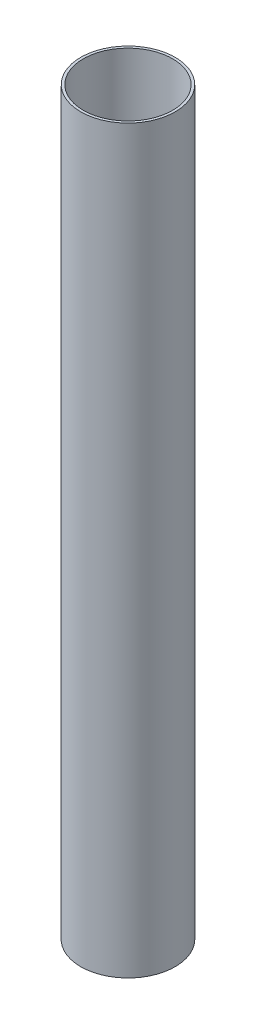
ISO-10303-21;
HEADER;
FILE_DESCRIPTION(('STEP AP214'),'2;1');
FILE_NAME('part.step','',(''),(''),'','','');
FILE_SCHEMA(('AUTOMOTIVE_DESIGN { 1 0 10303 214 1 1 1 1 }'));
ENDSEC;
DATA;
#1=APPLICATION_CONTEXT('core data for automotive mechanical design processes');
#2=APPLICATION_PROTOCOL_DEFINITION('international standard','automotive_design',2000,#1);
#3=PRODUCT_CONTEXT('',#1,'mechanical');
#4=PRODUCT('Part','Part','',(#3));
#5=PRODUCT_RELATED_PRODUCT_CATEGORY('part','',(#4));
#6=PRODUCT_DEFINITION_FORMATION('','',#4);
#7=PRODUCT_DEFINITION_CONTEXT('part definition',#1,'design');
#8=PRODUCT_DEFINITION('design','',#6,#7);
#9=PRODUCT_DEFINITION_SHAPE('','',#8);
#10=(LENGTH_UNIT() NAMED_UNIT(*) SI_UNIT(.MILLI.,.METRE.));
#11=(NAMED_UNIT(*) PLANE_ANGLE_UNIT() SI_UNIT($,.RADIAN.));
#12=(NAMED_UNIT(*) SI_UNIT($,.STERADIAN.) SOLID_ANGLE_UNIT());
#13=UNCERTAINTY_MEASURE_WITH_UNIT(LENGTH_MEASURE(1.E-05),#10,'distance_accuracy_value','');
#14=(GEOMETRIC_REPRESENTATION_CONTEXT(3) GLOBAL_UNCERTAINTY_ASSIGNED_CONTEXT((#13)) GLOBAL_UNIT_ASSIGNED_CONTEXT((#10,
#11,#12)) REPRESENTATION_CONTEXT('',''));
#15=CARTESIAN_POINT('',(0.,0.,0.));
#16=DIRECTION('',(0.,0.,1.));
#17=DIRECTION('',(1.,0.,0.));
#18=AXIS2_PLACEMENT_3D('',#15,#16,#17);
#19=CARTESIAN_POINT('',(0.,0.,0.));
#20=DIRECTION('',(0.,1.,0.));
#21=DIRECTION('',(0.,0.,1.));
#22=AXIS2_PLACEMENT_3D('',#19,#20,#21);
#23=CYLINDRICAL_SURFACE('',#22,46.99);
#24=CARTESIAN_POINT('',(0.,736.6,0.));
#25=DIRECTION('',(0.,1.,0.));
#26=DIRECTION('',(0.,0.,1.));
#27=AXIS2_PLACEMENT_3D('',#24,#25,#26);
#28=CIRCLE('',#27,46.99);
#29=CARTESIAN_POINT('',(0.,736.6,46.99));
#30=VERTEX_POINT('',#29);
#31=EDGE_CURVE('E51',#30,#30,#28,.T.);
#32=ORIENTED_EDGE('',*,*,#31,.F.);
#33=EDGE_LOOP('',(#32));
#34=FACE_BOUND('',#33,.T.);
#35=CARTESIAN_POINT('',(0.,0.,0.));
#36=DIRECTION('',(0.,1.,0.));
#37=DIRECTION('',(0.,0.,1.));
#38=AXIS2_PLACEMENT_3D('',#35,#36,#37);
#39=CIRCLE('',#38,46.99);
#40=CARTESIAN_POINT('',(0.,0.,46.99));
#41=VERTEX_POINT('',#40);
#42=EDGE_CURVE('E40',#41,#41,#39,.T.);
#43=ORIENTED_EDGE('',*,*,#42,.T.);
#44=EDGE_LOOP('',(#43));
#45=FACE_BOUND('',#44,.T.);
#46=ADVANCED_FACE('F37',(#34,#45),#23,.T.);
#47=CARTESIAN_POINT('',(0.,0.,0.));
#48=DIRECTION('',(0.,1.,0.));
#49=DIRECTION('',(0.,0.,1.));
#50=AXIS2_PLACEMENT_3D('',#47,#48,#49);
#51=PLANE('',#50);
#52=CARTESIAN_POINT('',(0.,0.,0.));
#53=DIRECTION('',(0.,1.,0.));
#54=DIRECTION('',(0.,0.,1.));
#55=AXIS2_PLACEMENT_3D('',#52,#53,#54);
#56=CIRCLE('',#55,44.45);
#57=CARTESIAN_POINT('',(0.,0.,44.45));
#58=VERTEX_POINT('',#57);
#59=EDGE_CURVE('E45',#58,#58,#56,.F.);
#60=ORIENTED_EDGE('',*,*,#59,.F.);
#61=EDGE_LOOP('',(#60));
#62=FACE_BOUND('',#61,.T.);
#63=ORIENTED_EDGE('',*,*,#42,.F.);
#64=EDGE_LOOP('',(#63));
#65=FACE_BOUND('',#64,.T.);
#66=ADVANCED_FACE('F62',(#62,#65),#51,.F.);
#67=CARTESIAN_POINT('',(0.,736.6,0.));
#68=DIRECTION('',(0.,1.,0.));
#69=DIRECTION('',(0.,0.,1.));
#70=AXIS2_PLACEMENT_3D('',#67,#68,#69);
#71=PLANE('',#70);
#72=CARTESIAN_POINT('',(0.,736.6,0.));
#73=DIRECTION('',(0.,1.,0.));
#74=DIRECTION('',(0.,0.,1.));
#75=AXIS2_PLACEMENT_3D('',#72,#73,#74);
#76=CIRCLE('',#75,44.45);
#77=CARTESIAN_POINT('',(0.,736.6,44.45));
#78=VERTEX_POINT('',#77);
#79=EDGE_CURVE('E10',#78,#78,#76,.F.);
#80=ORIENTED_EDGE('',*,*,#79,.T.);
#81=EDGE_LOOP('',(#80));
#82=FACE_BOUND('',#81,.T.);
#83=ORIENTED_EDGE('',*,*,#31,.T.);
#84=EDGE_LOOP('',(#83));
#85=FACE_BOUND('',#84,.T.);
#86=ADVANCED_FACE('F64',(#82,#85),#71,.T.);
#87=CARTESIAN_POINT('',(0.,0.,0.));
#88=DIRECTION('',(0.,1.,0.));
#89=DIRECTION('',(0.,0.,1.));
#90=AXIS2_PLACEMENT_3D('',#87,#88,#89);
#91=CYLINDRICAL_SURFACE('',#90,44.45);
#92=ORIENTED_EDGE('',*,*,#79,.F.);
#93=EDGE_LOOP('',(#92));
#94=FACE_BOUND('',#93,.T.);
#95=ORIENTED_EDGE('',*,*,#59,.T.);
#96=EDGE_LOOP('',(#95));
#97=FACE_BOUND('',#96,.T.);
#98=ADVANCED_FACE('F70',(#94,#97),#91,.F.);
#99=CLOSED_SHELL('',(#46,#66,#86,#98));
#100=MANIFOLD_SOLID_BREP('B2',#99);
#101=ADVANCED_BREP_SHAPE_REPRESENTATION('',(#18,#100),#14);
#102=SHAPE_DEFINITION_REPRESENTATION(#9,#101);
ENDSEC;
END-ISO-10303-21;
